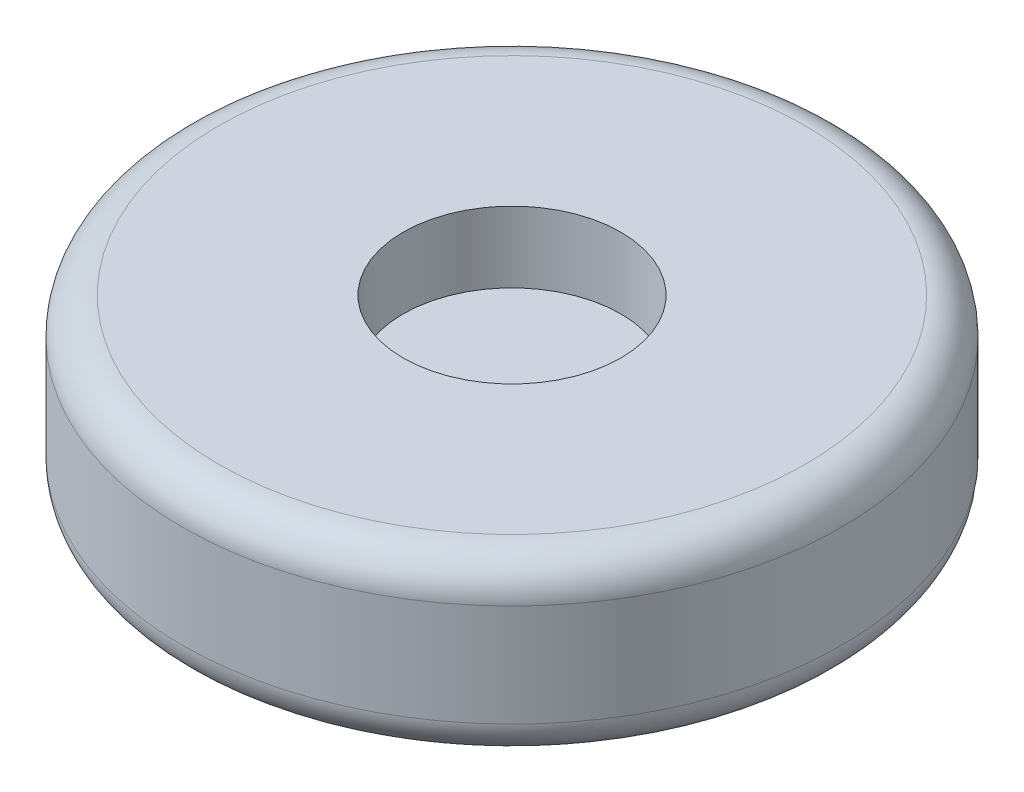
ISO-10303-21;
HEADER;
FILE_DESCRIPTION(('STEP AP214'),'2;1');
FILE_NAME('part.step','',(''),(''),'','','');
FILE_SCHEMA(('AUTOMOTIVE_DESIGN { 1 0 10303 214 1 1 1 1 }'));
ENDSEC;
DATA;
#1=APPLICATION_CONTEXT('core data for automotive mechanical design processes');
#2=APPLICATION_PROTOCOL_DEFINITION('international standard','automotive_design',2000,#1);
#3=PRODUCT_CONTEXT('',#1,'mechanical');
#4=PRODUCT('Part','Part','',(#3));
#5=PRODUCT_RELATED_PRODUCT_CATEGORY('part','',(#4));
#6=PRODUCT_DEFINITION_FORMATION('','',#4);
#7=PRODUCT_DEFINITION_CONTEXT('part definition',#1,'design');
#8=PRODUCT_DEFINITION('design','',#6,#7);
#9=PRODUCT_DEFINITION_SHAPE('','',#8);
#10=(LENGTH_UNIT() NAMED_UNIT(*) SI_UNIT(.MILLI.,.METRE.));
#11=(NAMED_UNIT(*) PLANE_ANGLE_UNIT() SI_UNIT($,.RADIAN.));
#12=(NAMED_UNIT(*) SI_UNIT($,.STERADIAN.) SOLID_ANGLE_UNIT());
#13=UNCERTAINTY_MEASURE_WITH_UNIT(LENGTH_MEASURE(1.E-05),#10,'distance_accuracy_value','');
#14=(GEOMETRIC_REPRESENTATION_CONTEXT(3) GLOBAL_UNCERTAINTY_ASSIGNED_CONTEXT((#13)) GLOBAL_UNIT_ASSIGNED_CONTEXT((#10,
#11,#12)) REPRESENTATION_CONTEXT('',''));
#15=CARTESIAN_POINT('',(0.,0.,0.));
#16=DIRECTION('',(0.,0.,1.));
#17=DIRECTION('',(1.,0.,0.));
#18=AXIS2_PLACEMENT_3D('',#15,#16,#17);
#19=CARTESIAN_POINT('',(0.,41.2342505629703,0.));
#20=DIRECTION('',(0.,1.,0.));
#21=DIRECTION('',(0.,0.,1.));
#22=AXIS2_PLACEMENT_3D('',#19,#20,#21);
#23=CYLINDRICAL_SURFACE('',#22,14.25);
#24=CARTESIAN_POINT('',(0.,-9.61804815357217,0.));
#25=DIRECTION('',(0.,1.,0.));
#26=DIRECTION('',(0.,0.,1.));
#27=AXIS2_PLACEMENT_3D('',#24,#25,#26);
#28=CIRCLE('',#27,14.25);
#29=CARTESIAN_POINT('',(0.,-9.61804815357217,14.25));
#30=VERTEX_POINT('',#29);
#31=EDGE_CURVE('E10',#30,#30,#28,.T.);
#32=ORIENTED_EDGE('',*,*,#31,.T.);
#33=EDGE_LOOP('',(#32));
#34=FACE_BOUND('',#33,.T.);
#35=CARTESIAN_POINT('',(0.,-12.1180481535722,0.));
#36=DIRECTION('',(0.,1.,0.));
#37=DIRECTION('',(0.,0.,1.));
#38=AXIS2_PLACEMENT_3D('',#35,#36,#37);
#39=CIRCLE('',#38,14.25);
#40=CARTESIAN_POINT('',(0.,-12.1180481535722,14.25));
#41=VERTEX_POINT('',#40);
#42=EDGE_CURVE('E59',#41,#41,#39,.T.);
#43=ORIENTED_EDGE('',*,*,#42,.F.);
#44=EDGE_LOOP('',(#43));
#45=FACE_BOUND('',#44,.T.);
#46=ADVANCED_FACE('F31',(#34,#45),#23,.F.);
#47=CARTESIAN_POINT('',(0.,-9.61804815357217,5.99999999999999));
#48=DIRECTION('',(0.,-1.,0.));
#49=DIRECTION('',(0.,0.,-1.));
#50=AXIS2_PLACEMENT_3D('',#47,#48,#49);
#51=PLANE('',#50);
#52=CARTESIAN_POINT('',(0.,-9.61804815357217,0.));
#53=DIRECTION('',(0.,1.,0.));
#54=DIRECTION('',(0.,0.,1.));
#55=AXIS2_PLACEMENT_3D('',#52,#53,#54);
#56=CIRCLE('',#55,5.99999999999999);
#57=CARTESIAN_POINT('',(0.,-9.61804815357217,5.99999999999999));
#58=VERTEX_POINT('',#57);
#59=EDGE_CURVE('E37',#58,#58,#56,.T.);
#60=ORIENTED_EDGE('',*,*,#59,.T.);
#61=EDGE_LOOP('',(#60));
#62=FACE_BOUND('',#61,.T.);
#63=ORIENTED_EDGE('',*,*,#31,.F.);
#64=EDGE_LOOP('',(#63));
#65=FACE_BOUND('',#64,.T.);
#66=ADVANCED_FACE('F66',(#62,#65),#51,.T.);
#67=CARTESIAN_POINT('',(0.,41.2342505629703,0.));
#68=DIRECTION('',(0.,1.,0.));
#69=DIRECTION('',(0.,0.,1.));
#70=AXIS2_PLACEMENT_3D('',#67,#68,#69);
#71=CYLINDRICAL_SURFACE('',#70,5.99999999999999);
#72=CARTESIAN_POINT('',(0.,-5.71804815357217,0.));
#73=DIRECTION('',(0.,1.,0.));
#74=DIRECTION('',(0.,0.,1.));
#75=AXIS2_PLACEMENT_3D('',#72,#73,#74);
#76=CIRCLE('',#75,5.99999999999999);
#77=CARTESIAN_POINT('',(0.,-5.71804815357217,5.99999999999999));
#78=VERTEX_POINT('',#77);
#79=EDGE_CURVE('E41',#78,#78,#76,.T.);
#80=ORIENTED_EDGE('',*,*,#79,.T.);
#81=EDGE_LOOP('',(#80));
#82=FACE_BOUND('',#81,.T.);
#83=ORIENTED_EDGE('',*,*,#59,.F.);
#84=EDGE_LOOP('',(#83));
#85=FACE_BOUND('',#84,.T.);
#86=ADVANCED_FACE('F70',(#82,#85),#71,.F.);
#87=CARTESIAN_POINT('',(0.,-5.71804815357217,16.15));
#88=DIRECTION('',(0.,1.,0.));
#89=DIRECTION('',(0.,0.,1.));
#90=AXIS2_PLACEMENT_3D('',#87,#88,#89);
#91=PLANE('',#90);
#92=CARTESIAN_POINT('',(0.,-5.71804815357217,0.));
#93=DIRECTION('',(0.,1.,0.));
#94=DIRECTION('',(0.,0.,1.));
#95=AXIS2_PLACEMENT_3D('',#92,#93,#94);
#96=CIRCLE('',#95,16.15);
#97=CARTESIAN_POINT('',(0.,-5.71804815357217,16.15));
#98=VERTEX_POINT('',#97);
#99=EDGE_CURVE('E45',#98,#98,#96,.T.);
#100=ORIENTED_EDGE('',*,*,#99,.T.);
#101=EDGE_LOOP('',(#100));
#102=FACE_BOUND('',#101,.T.);
#103=ORIENTED_EDGE('',*,*,#79,.F.);
#104=EDGE_LOOP('',(#103));
#105=FACE_BOUND('',#104,.T.);
#106=ADVANCED_FACE('F74',(#102,#105),#91,.T.);
#107=CARTESIAN_POINT('',(0.,-7.71804815357217,0.));
#108=DIRECTION('',(0.,1.,0.));
#109=DIRECTION('',(0.,0.,1.));
#110=AXIS2_PLACEMENT_3D('',#107,#108,#109);
#111=TOROIDAL_SURFACE('',#110,16.15,2.);
#112=CARTESIAN_POINT('',(0.,-7.71804815357217,0.));
#113=DIRECTION('',(0.,1.,0.));
#114=DIRECTION('',(0.,0.,1.));
#115=AXIS2_PLACEMENT_3D('',#112,#113,#114);
#116=CIRCLE('',#115,18.15);
#117=CARTESIAN_POINT('',(0.,-7.71804815357217,18.15));
#118=VERTEX_POINT('',#117);
#119=EDGE_CURVE('E50',#118,#118,#116,.T.);
#120=ORIENTED_EDGE('',*,*,#119,.T.);
#121=EDGE_LOOP('',(#120));
#122=FACE_BOUND('',#121,.T.);
#123=ORIENTED_EDGE('',*,*,#99,.F.);
#124=EDGE_LOOP('',(#123));
#125=FACE_BOUND('',#124,.T.);
#126=ADVANCED_FACE('F81',(#122,#125),#111,.T.);
#127=CARTESIAN_POINT('',(0.,41.2342505629703,0.));
#128=DIRECTION('',(0.,1.,0.));
#129=DIRECTION('',(0.,0.,1.));
#130=AXIS2_PLACEMENT_3D('',#127,#128,#129);
#131=CYLINDRICAL_SURFACE('',#130,18.15);
#132=CARTESIAN_POINT('',(0.,-13.3480481535722,0.));
#133=DIRECTION('',(0.,1.,0.));
#134=DIRECTION('',(0.,0.,1.));
#135=AXIS2_PLACEMENT_3D('',#132,#133,#134);
#136=CIRCLE('',#135,18.15);
#137=CARTESIAN_POINT('',(0.,-13.3480481535722,18.15));
#138=VERTEX_POINT('',#137);
#139=EDGE_CURVE('E53',#138,#138,#136,.T.);
#140=ORIENTED_EDGE('',*,*,#139,.T.);
#141=EDGE_LOOP('',(#140));
#142=FACE_BOUND('',#141,.T.);
#143=ORIENTED_EDGE('',*,*,#119,.F.);
#144=EDGE_LOOP('',(#143));
#145=FACE_BOUND('',#144,.T.);
#146=ADVANCED_FACE('F85',(#142,#145),#131,.T.);
#147=CARTESIAN_POINT('',(0.,-13.3480481535722,0.));
#148=DIRECTION('',(0.,1.,0.));
#149=DIRECTION('',(0.,0.,1.));
#150=AXIS2_PLACEMENT_3D('',#147,#148,#149);
#151=TOROIDAL_SURFACE('',#150,16.15,2.);
#152=CARTESIAN_POINT('',(0.,-15.3480481535722,0.));
#153=DIRECTION('',(0.,1.,0.));
#154=DIRECTION('',(0.,0.,1.));
#155=AXIS2_PLACEMENT_3D('',#152,#153,#154);
#156=CIRCLE('',#155,16.15);
#157=CARTESIAN_POINT('',(0.,-15.3480481535722,16.15));
#158=VERTEX_POINT('',#157);
#159=EDGE_CURVE('E56',#158,#158,#156,.T.);
#160=ORIENTED_EDGE('',*,*,#159,.T.);
#161=EDGE_LOOP('',(#160));
#162=FACE_BOUND('',#161,.T.);
#163=ORIENTED_EDGE('',*,*,#139,.F.);
#164=EDGE_LOOP('',(#163));
#165=FACE_BOUND('',#164,.T.);
#166=ADVANCED_FACE('F89',(#162,#165),#151,.T.);
#167=CARTESIAN_POINT('',(0.,-15.3480481535722,0.));
#168=DIRECTION('',(0.,-1.,0.));
#169=DIRECTION('',(0.,0.,-1.));
#170=AXIS2_PLACEMENT_3D('',#167,#168,#169);
#171=PLANE('',#170);
#172=ORIENTED_EDGE('',*,*,#159,.F.);
#173=EDGE_LOOP('',(#172));
#174=FACE_BOUND('',#173,.T.);
#175=ADVANCED_FACE('F93',(#174),#171,.T.);
#176=CARTESIAN_POINT('',(0.,-12.1180481535722,14.25));
#177=DIRECTION('',(0.,1.,0.));
#178=DIRECTION('',(0.,0.,1.));
#179=AXIS2_PLACEMENT_3D('',#176,#177,#178);
#180=PLANE('',#179);
#181=ORIENTED_EDGE('',*,*,#42,.T.);
#182=EDGE_LOOP('',(#181));
#183=FACE_BOUND('',#182,.T.);
#184=ADVANCED_FACE('F63',(#183),#180,.T.);
#185=CLOSED_SHELL('',(#46,#66,#86,#106,#126,#146,#166,#175,#184));
#186=MANIFOLD_SOLID_BREP('B2',#185);
#187=ADVANCED_BREP_SHAPE_REPRESENTATION('',(#18,#186),#14);
#188=SHAPE_DEFINITION_REPRESENTATION(#9,#187);
ENDSEC;
END-ISO-10303-21;
